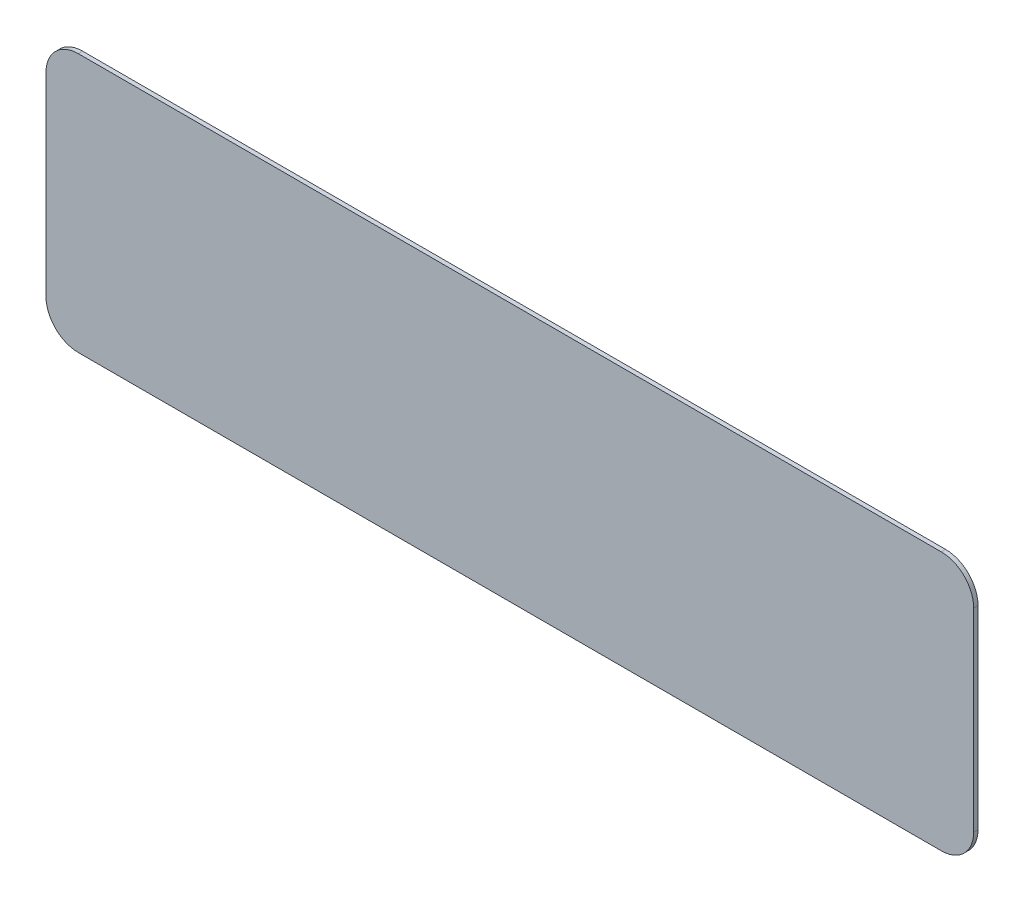
ISO-10303-21;
HEADER;
FILE_DESCRIPTION(('STEP AP214'),'2;1');
FILE_NAME('part.step','',(''),(''),'','','');
FILE_SCHEMA(('AUTOMOTIVE_DESIGN { 1 0 10303 214 1 1 1 1 }'));
ENDSEC;
DATA;
#1=APPLICATION_CONTEXT('core data for automotive mechanical design processes');
#2=APPLICATION_PROTOCOL_DEFINITION('international standard','automotive_design',2000,#1);
#3=PRODUCT_CONTEXT('',#1,'mechanical');
#4=PRODUCT('Part','Part','',(#3));
#5=PRODUCT_RELATED_PRODUCT_CATEGORY('part','',(#4));
#6=PRODUCT_DEFINITION_FORMATION('','',#4);
#7=PRODUCT_DEFINITION_CONTEXT('part definition',#1,'design');
#8=PRODUCT_DEFINITION('design','',#6,#7);
#9=PRODUCT_DEFINITION_SHAPE('','',#8);
#10=(LENGTH_UNIT() NAMED_UNIT(*) SI_UNIT(.MILLI.,.METRE.));
#11=(NAMED_UNIT(*) PLANE_ANGLE_UNIT() SI_UNIT($,.RADIAN.));
#12=(NAMED_UNIT(*) SI_UNIT($,.STERADIAN.) SOLID_ANGLE_UNIT());
#13=UNCERTAINTY_MEASURE_WITH_UNIT(LENGTH_MEASURE(1.E-05),#10,'distance_accuracy_value','');
#14=(GEOMETRIC_REPRESENTATION_CONTEXT(3) GLOBAL_UNCERTAINTY_ASSIGNED_CONTEXT((#13)) GLOBAL_UNIT_ASSIGNED_CONTEXT((#10,
#11,#12)) REPRESENTATION_CONTEXT('',''));
#15=CARTESIAN_POINT('',(0.,0.,0.));
#16=DIRECTION('',(0.,0.,1.));
#17=DIRECTION('',(1.,0.,0.));
#18=AXIS2_PLACEMENT_3D('',#15,#16,#17);
#19=CARTESIAN_POINT('',(-20.,-4.5,0.2));
#20=DIRECTION('',(0.,0.,-1.));
#21=DIRECTION('',(-1.,0.,0.));
#22=AXIS2_PLACEMENT_3D('',#19,#20,#21);
#23=CYLINDRICAL_SURFACE('',#22,1.5);
#24=CARTESIAN_POINT('',(-20.,-4.5,0.));
#25=DIRECTION('',(0.,0.,1.));
#26=DIRECTION('',(-1.,0.,0.));
#27=AXIS2_PLACEMENT_3D('',#24,#25,#26);
#28=CIRCLE('',#27,1.5);
#29=CARTESIAN_POINT('',(-21.5,-4.49999999999999,0.));
#30=VERTEX_POINT('',#29);
#31=CARTESIAN_POINT('',(-20.,-6.,0.));
#32=VERTEX_POINT('',#31);
#33=EDGE_CURVE('E129',#30,#32,#28,.T.);
#34=ORIENTED_EDGE('',*,*,#33,.T.);
#35=DIRECTION('',(0.,0.,-1.));
#36=VECTOR('',#35,1.);
#37=CARTESIAN_POINT('',(-20.,-6.,0.2));
#38=LINE('',#37,#36);
#39=CARTESIAN_POINT('',(-20.,-6.,0.2));
#40=VERTEX_POINT('',#39);
#41=EDGE_CURVE('E11',#40,#32,#38,.T.);
#42=ORIENTED_EDGE('',*,*,#41,.F.);
#43=CARTESIAN_POINT('',(-20.,-4.5,0.2));
#44=DIRECTION('',(0.,0.,1.));
#45=DIRECTION('',(-1.,0.,0.));
#46=AXIS2_PLACEMENT_3D('',#43,#44,#45);
#47=CIRCLE('',#46,1.5);
#48=CARTESIAN_POINT('',(-21.5,-4.49999999999999,0.2));
#49=VERTEX_POINT('',#48);
#50=EDGE_CURVE('E143',#49,#40,#47,.T.);
#51=ORIENTED_EDGE('',*,*,#50,.F.);
#52=DIRECTION('',(0.,0.,-1.));
#53=VECTOR('',#52,1.);
#54=CARTESIAN_POINT('',(-21.5,-4.49999999999999,0.2));
#55=LINE('',#54,#53);
#56=EDGE_CURVE('E125',#49,#30,#55,.T.);
#57=ORIENTED_EDGE('',*,*,#56,.T.);
#58=EDGE_LOOP('',(#34,#42,#51,#57));
#59=FACE_BOUND('',#58,.T.);
#60=ADVANCED_FACE('F33',(#59),#23,.T.);
#61=CARTESIAN_POINT('',(-20.,-6.,0.2));
#62=DIRECTION('',(0.,1.,0.));
#63=DIRECTION('',(0.,0.,1.));
#64=AXIS2_PLACEMENT_3D('',#61,#62,#63);
#65=PLANE('',#64);
#66=DIRECTION('',(1.,0.,0.));
#67=VECTOR('',#66,1.);
#68=CARTESIAN_POINT('',(-20.,-6.,0.));
#69=LINE('',#68,#67);
#70=CARTESIAN_POINT('',(20.,-6.,0.));
#71=VERTEX_POINT('',#70);
#72=EDGE_CURVE('E132',#32,#71,#69,.T.);
#73=ORIENTED_EDGE('',*,*,#72,.T.);
#74=DIRECTION('',(0.,0.,-1.));
#75=VECTOR('',#74,1.);
#76=CARTESIAN_POINT('',(20.,-6.,0.2));
#77=LINE('',#76,#75);
#78=CARTESIAN_POINT('',(20.,-6.,0.2));
#79=VERTEX_POINT('',#78);
#80=EDGE_CURVE('E41',#79,#71,#77,.T.);
#81=ORIENTED_EDGE('',*,*,#80,.F.);
#82=DIRECTION('',(1.,0.,0.));
#83=VECTOR('',#82,1.);
#84=CARTESIAN_POINT('',(-20.,-6.,0.2));
#85=LINE('',#84,#83);
#86=EDGE_CURVE('E92',#40,#79,#85,.T.);
#87=ORIENTED_EDGE('',*,*,#86,.F.);
#88=ORIENTED_EDGE('',*,*,#41,.T.);
#89=EDGE_LOOP('',(#73,#81,#87,#88));
#90=FACE_BOUND('',#89,.T.);
#91=ADVANCED_FACE('F178',(#90),#65,.F.);
#92=CARTESIAN_POINT('',(20.,-4.5,0.2));
#93=DIRECTION('',(0.,0.,-1.));
#94=DIRECTION('',(-1.,0.,0.));
#95=AXIS2_PLACEMENT_3D('',#92,#93,#94);
#96=CYLINDRICAL_SURFACE('',#95,1.5);
#97=CARTESIAN_POINT('',(20.,-4.5,0.));
#98=DIRECTION('',(0.,0.,1.));
#99=DIRECTION('',(1.,0.,0.));
#100=AXIS2_PLACEMENT_3D('',#97,#98,#99);
#101=CIRCLE('',#100,1.5);
#102=CARTESIAN_POINT('',(21.5,-4.5,0.));
#103=VERTEX_POINT('',#102);
#104=EDGE_CURVE('E134',#71,#103,#101,.T.);
#105=ORIENTED_EDGE('',*,*,#104,.T.);
#106=DIRECTION('',(0.,0.,-1.));
#107=VECTOR('',#106,1.);
#108=CARTESIAN_POINT('',(21.5,-4.5,0.2));
#109=LINE('',#108,#107);
#110=CARTESIAN_POINT('',(21.5,-4.5,0.2));
#111=VERTEX_POINT('',#110);
#112=EDGE_CURVE('E150',#111,#103,#109,.T.);
#113=ORIENTED_EDGE('',*,*,#112,.F.);
#114=CARTESIAN_POINT('',(20.,-4.5,0.2));
#115=DIRECTION('',(0.,0.,1.));
#116=DIRECTION('',(1.,0.,0.));
#117=AXIS2_PLACEMENT_3D('',#114,#115,#116);
#118=CIRCLE('',#117,1.5);
#119=EDGE_CURVE('E158',#79,#111,#118,.T.);
#120=ORIENTED_EDGE('',*,*,#119,.F.);
#121=ORIENTED_EDGE('',*,*,#80,.T.);
#122=EDGE_LOOP('',(#105,#113,#120,#121));
#123=FACE_BOUND('',#122,.T.);
#124=ADVANCED_FACE('F156',(#123),#96,.T.);
#125=CARTESIAN_POINT('',(21.5,-4.49999999999999,0.2));
#126=DIRECTION('',(-1.,0.,0.));
#127=DIRECTION('',(0.,0.,1.));
#128=AXIS2_PLACEMENT_3D('',#125,#126,#127);
#129=PLANE('',#128);
#130=DIRECTION('',(0.,1.,0.));
#131=VECTOR('',#130,1.);
#132=CARTESIAN_POINT('',(21.5,-4.49999999999999,0.));
#133=LINE('',#132,#131);
#134=CARTESIAN_POINT('',(21.5,4.49999999999999,0.));
#135=VERTEX_POINT('',#134);
#136=EDGE_CURVE('E136',#103,#135,#133,.T.);
#137=ORIENTED_EDGE('',*,*,#136,.T.);
#138=DIRECTION('',(0.,0.,-1.));
#139=VECTOR('',#138,1.);
#140=CARTESIAN_POINT('',(21.5,4.49999999999999,0.2));
#141=LINE('',#140,#139);
#142=CARTESIAN_POINT('',(21.5,4.49999999999999,0.2));
#143=VERTEX_POINT('',#142);
#144=EDGE_CURVE('E147',#143,#135,#141,.T.);
#145=ORIENTED_EDGE('',*,*,#144,.F.);
#146=DIRECTION('',(0.,1.,0.));
#147=VECTOR('',#146,1.);
#148=CARTESIAN_POINT('',(21.5,-4.49999999999999,0.2));
#149=LINE('',#148,#147);
#150=EDGE_CURVE('E170',#111,#143,#149,.T.);
#151=ORIENTED_EDGE('',*,*,#150,.F.);
#152=ORIENTED_EDGE('',*,*,#112,.T.);
#153=EDGE_LOOP('',(#137,#145,#151,#152));
#154=FACE_BOUND('',#153,.T.);
#155=ADVANCED_FACE('F166',(#154),#129,.F.);
#156=CARTESIAN_POINT('',(20.,4.5,0.2));
#157=DIRECTION('',(0.,0.,-1.));
#158=DIRECTION('',(-1.,0.,0.));
#159=AXIS2_PLACEMENT_3D('',#156,#157,#158);
#160=CYLINDRICAL_SURFACE('',#159,1.5);
#161=CARTESIAN_POINT('',(20.,4.5,0.));
#162=DIRECTION('',(0.,0.,1.));
#163=DIRECTION('',(-1.,0.,0.));
#164=AXIS2_PLACEMENT_3D('',#161,#162,#163);
#165=CIRCLE('',#164,1.5);
#166=CARTESIAN_POINT('',(20.,6.,0.));
#167=VERTEX_POINT('',#166);
#168=EDGE_CURVE('E138',#135,#167,#165,.T.);
#169=ORIENTED_EDGE('',*,*,#168,.T.);
#170=DIRECTION('',(0.,0.,-1.));
#171=VECTOR('',#170,1.);
#172=CARTESIAN_POINT('',(20.,6.,0.2));
#173=LINE('',#172,#171);
#174=CARTESIAN_POINT('',(20.,6.,0.2));
#175=VERTEX_POINT('',#174);
#176=EDGE_CURVE('E120',#175,#167,#173,.T.);
#177=ORIENTED_EDGE('',*,*,#176,.F.);
#178=CARTESIAN_POINT('',(20.,4.5,0.2));
#179=DIRECTION('',(0.,0.,1.));
#180=DIRECTION('',(-1.,0.,0.));
#181=AXIS2_PLACEMENT_3D('',#178,#179,#180);
#182=CIRCLE('',#181,1.5);
#183=EDGE_CURVE('E111',#143,#175,#182,.T.);
#184=ORIENTED_EDGE('',*,*,#183,.F.);
#185=ORIENTED_EDGE('',*,*,#144,.T.);
#186=EDGE_LOOP('',(#169,#177,#184,#185));
#187=FACE_BOUND('',#186,.T.);
#188=ADVANCED_FACE('F169',(#187),#160,.T.);
#189=CARTESIAN_POINT('',(-20.,6.,0.2));
#190=DIRECTION('',(0.,-1.,0.));
#191=DIRECTION('',(0.,0.,-1.));
#192=AXIS2_PLACEMENT_3D('',#189,#190,#191);
#193=PLANE('',#192);
#194=DIRECTION('',(-1.,0.,0.));
#195=VECTOR('',#194,1.);
#196=CARTESIAN_POINT('',(-20.,6.,0.));
#197=LINE('',#196,#195);
#198=CARTESIAN_POINT('',(-20.,6.,0.));
#199=VERTEX_POINT('',#198);
#200=EDGE_CURVE('E119',#167,#199,#197,.T.);
#201=ORIENTED_EDGE('',*,*,#200,.T.);
#202=DIRECTION('',(0.,0.,-1.));
#203=VECTOR('',#202,1.);
#204=CARTESIAN_POINT('',(-20.,6.,0.2));
#205=LINE('',#204,#203);
#206=CARTESIAN_POINT('',(-20.,6.,0.2));
#207=VERTEX_POINT('',#206);
#208=EDGE_CURVE('E116',#207,#199,#205,.T.);
#209=ORIENTED_EDGE('',*,*,#208,.F.);
#210=DIRECTION('',(-1.,0.,0.));
#211=VECTOR('',#210,1.);
#212=CARTESIAN_POINT('',(-20.,6.,0.2));
#213=LINE('',#212,#211);
#214=EDGE_CURVE('E105',#175,#207,#213,.T.);
#215=ORIENTED_EDGE('',*,*,#214,.F.);
#216=ORIENTED_EDGE('',*,*,#176,.T.);
#217=EDGE_LOOP('',(#201,#209,#215,#216));
#218=FACE_BOUND('',#217,.T.);
#219=ADVANCED_FACE('F117',(#218),#193,.F.);
#220=CARTESIAN_POINT('',(-20.,4.5,0.2));
#221=DIRECTION('',(0.,0.,-1.));
#222=DIRECTION('',(-1.,0.,0.));
#223=AXIS2_PLACEMENT_3D('',#220,#221,#222);
#224=CYLINDRICAL_SURFACE('',#223,1.5);
#225=CARTESIAN_POINT('',(-20.,4.5,0.));
#226=DIRECTION('',(0.,0.,1.));
#227=DIRECTION('',(-1.,0.,0.));
#228=AXIS2_PLACEMENT_3D('',#225,#226,#227);
#229=CIRCLE('',#228,1.5);
#230=CARTESIAN_POINT('',(-21.5,4.49999999999999,0.));
#231=VERTEX_POINT('',#230);
#232=EDGE_CURVE('E78',#199,#231,#229,.T.);
#233=ORIENTED_EDGE('',*,*,#232,.T.);
#234=DIRECTION('',(0.,0.,-1.));
#235=VECTOR('',#234,1.);
#236=CARTESIAN_POINT('',(-21.5,4.49999999999999,0.2));
#237=LINE('',#236,#235);
#238=CARTESIAN_POINT('',(-21.5,4.49999999999999,0.2));
#239=VERTEX_POINT('',#238);
#240=EDGE_CURVE('E121',#239,#231,#237,.T.);
#241=ORIENTED_EDGE('',*,*,#240,.F.);
#242=CARTESIAN_POINT('',(-20.,4.5,0.2));
#243=DIRECTION('',(0.,0.,1.));
#244=DIRECTION('',(-1.,0.,0.));
#245=AXIS2_PLACEMENT_3D('',#242,#243,#244);
#246=CIRCLE('',#245,1.5);
#247=EDGE_CURVE('E109',#207,#239,#246,.T.);
#248=ORIENTED_EDGE('',*,*,#247,.F.);
#249=ORIENTED_EDGE('',*,*,#208,.T.);
#250=EDGE_LOOP('',(#233,#241,#248,#249));
#251=FACE_BOUND('',#250,.T.);
#252=ADVANCED_FACE('F123',(#251),#224,.T.);
#253=CARTESIAN_POINT('',(-21.5,-4.49999999999999,0.2));
#254=DIRECTION('',(1.,0.,0.));
#255=DIRECTION('',(0.,0.,-1.));
#256=AXIS2_PLACEMENT_3D('',#253,#254,#255);
#257=PLANE('',#256);
#258=DIRECTION('',(0.,-1.,0.));
#259=VECTOR('',#258,1.);
#260=CARTESIAN_POINT('',(-21.5,-4.49999999999999,0.));
#261=LINE('',#260,#259);
#262=EDGE_CURVE('E84',#231,#30,#261,.T.);
#263=ORIENTED_EDGE('',*,*,#262,.T.);
#264=ORIENTED_EDGE('',*,*,#56,.F.);
#265=DIRECTION('',(0.,-1.,0.));
#266=VECTOR('',#265,1.);
#267=CARTESIAN_POINT('',(-21.5,-4.49999999999999,0.2));
#268=LINE('',#267,#266);
#269=EDGE_CURVE('E49',#239,#49,#268,.T.);
#270=ORIENTED_EDGE('',*,*,#269,.F.);
#271=ORIENTED_EDGE('',*,*,#240,.T.);
#272=EDGE_LOOP('',(#263,#264,#270,#271));
#273=FACE_BOUND('',#272,.T.);
#274=ADVANCED_FACE('F194',(#273),#257,.F.);
#275=CARTESIAN_POINT('',(-20.,-4.5,0.2));
#276=DIRECTION('',(0.,0.,-1.));
#277=DIRECTION('',(-1.,0.,0.));
#278=AXIS2_PLACEMENT_3D('',#275,#276,#277);
#279=PLANE('',#278);
#280=ORIENTED_EDGE('',*,*,#50,.T.);
#281=ORIENTED_EDGE('',*,*,#86,.T.);
#282=ORIENTED_EDGE('',*,*,#119,.T.);
#283=ORIENTED_EDGE('',*,*,#150,.T.);
#284=ORIENTED_EDGE('',*,*,#183,.T.);
#285=ORIENTED_EDGE('',*,*,#214,.T.);
#286=ORIENTED_EDGE('',*,*,#247,.T.);
#287=ORIENTED_EDGE('',*,*,#269,.T.);
#288=EDGE_LOOP('',(#280,#281,#282,#283,#284,#285,#286,#287));
#289=FACE_BOUND('',#288,.T.);
#290=ADVANCED_FACE('F107',(#289),#279,.F.);
#291=CARTESIAN_POINT('',(-20.,-4.5,0.));
#292=DIRECTION('',(0.,0.,-1.));
#293=DIRECTION('',(-1.,0.,0.));
#294=AXIS2_PLACEMENT_3D('',#291,#292,#293);
#295=PLANE('',#294);
#296=ORIENTED_EDGE('',*,*,#33,.F.);
#297=ORIENTED_EDGE('',*,*,#262,.F.);
#298=ORIENTED_EDGE('',*,*,#232,.F.);
#299=ORIENTED_EDGE('',*,*,#200,.F.);
#300=ORIENTED_EDGE('',*,*,#168,.F.);
#301=ORIENTED_EDGE('',*,*,#136,.F.);
#302=ORIENTED_EDGE('',*,*,#104,.F.);
#303=ORIENTED_EDGE('',*,*,#72,.F.);
#304=EDGE_LOOP('',(#296,#297,#298,#299,#300,#301,#302,#303));
#305=FACE_BOUND('',#304,.T.);
#306=ADVANCED_FACE('F162',(#305),#295,.T.);
#307=CLOSED_SHELL('',(#60,#91,#124,#155,#188,#219,#252,#274,#290,#306));
#308=MANIFOLD_SOLID_BREP('B2',#307);
#309=ADVANCED_BREP_SHAPE_REPRESENTATION('',(#18,#308),#14);
#310=SHAPE_DEFINITION_REPRESENTATION(#9,#309);
ENDSEC;
END-ISO-10303-21;
